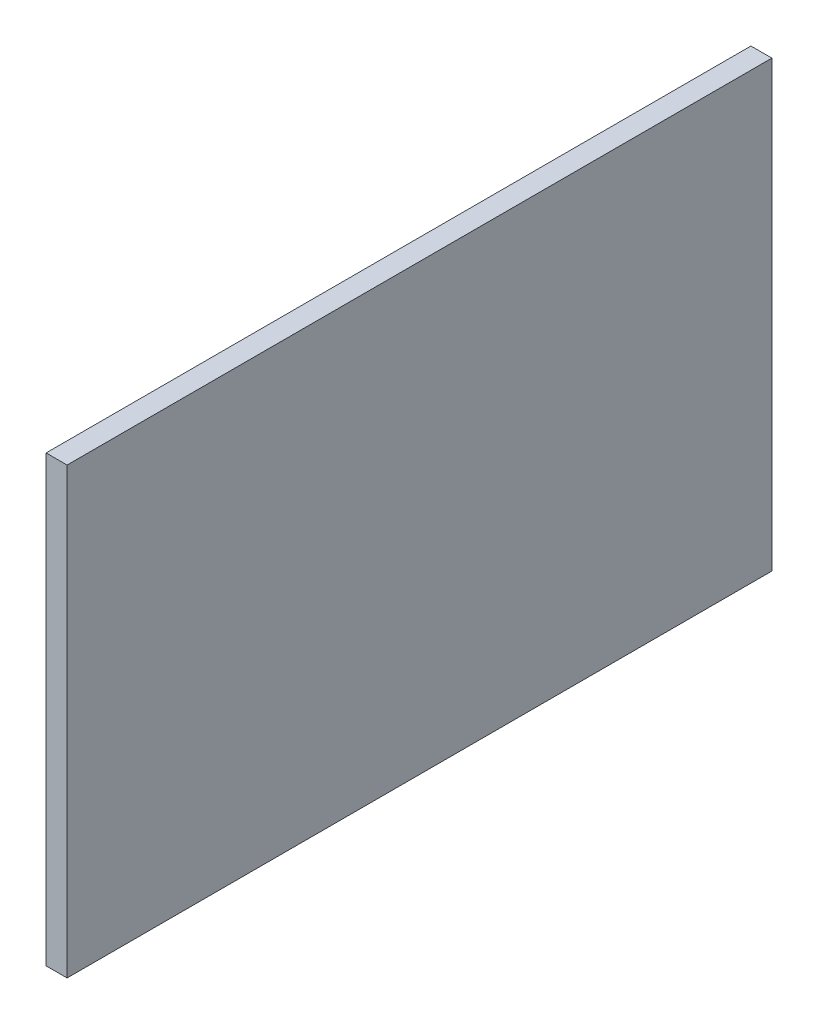
ISO-10303-21;
HEADER;
FILE_DESCRIPTION(('STEP AP214'),'2;1');
FILE_NAME('part.step','',(''),(''),'','','');
FILE_SCHEMA(('AUTOMOTIVE_DESIGN { 1 0 10303 214 1 1 1 1 }'));
ENDSEC;
DATA;
#1=APPLICATION_CONTEXT('core data for automotive mechanical design processes');
#2=APPLICATION_PROTOCOL_DEFINITION('international standard','automotive_design',2000,#1);
#3=PRODUCT_CONTEXT('',#1,'mechanical');
#4=PRODUCT('Part','Part','',(#3));
#5=PRODUCT_RELATED_PRODUCT_CATEGORY('part','',(#4));
#6=PRODUCT_DEFINITION_FORMATION('','',#4);
#7=PRODUCT_DEFINITION_CONTEXT('part definition',#1,'design');
#8=PRODUCT_DEFINITION('design','',#6,#7);
#9=PRODUCT_DEFINITION_SHAPE('','',#8);
#10=(LENGTH_UNIT() NAMED_UNIT(*) SI_UNIT(.MILLI.,.METRE.));
#11=(NAMED_UNIT(*) PLANE_ANGLE_UNIT() SI_UNIT($,.RADIAN.));
#12=(NAMED_UNIT(*) SI_UNIT($,.STERADIAN.) SOLID_ANGLE_UNIT());
#13=UNCERTAINTY_MEASURE_WITH_UNIT(LENGTH_MEASURE(1.E-05),#10,'distance_accuracy_value','');
#14=(GEOMETRIC_REPRESENTATION_CONTEXT(3) GLOBAL_UNCERTAINTY_ASSIGNED_CONTEXT((#13)) GLOBAL_UNIT_ASSIGNED_CONTEXT((#10,
#11,#12)) REPRESENTATION_CONTEXT('',''));
#15=CARTESIAN_POINT('',(0.,0.,0.));
#16=DIRECTION('',(0.,0.,1.));
#17=DIRECTION('',(1.,0.,0.));
#18=AXIS2_PLACEMENT_3D('',#15,#16,#17);
#19=CARTESIAN_POINT('',(10.5,-222.5,-353.));
#20=DIRECTION('',(-1.,0.,0.));
#21=DIRECTION('',(0.,0.,-1.));
#22=AXIS2_PLACEMENT_3D('',#19,#20,#21);
#23=PLANE('',#22);
#24=DIRECTION('',(0.,1.,0.));
#25=VECTOR('',#24,1.);
#26=CARTESIAN_POINT('',(10.5,-222.5,353.));
#27=LINE('',#26,#25);
#28=CARTESIAN_POINT('',(10.5,-222.5,353.));
#29=VERTEX_POINT('',#28);
#30=CARTESIAN_POINT('',(10.5,222.5,353.));
#31=VERTEX_POINT('',#30);
#32=EDGE_CURVE('E79',#29,#31,#27,.T.);
#33=ORIENTED_EDGE('',*,*,#32,.F.);
#34=DIRECTION('',(0.,0.,1.));
#35=VECTOR('',#34,1.);
#36=CARTESIAN_POINT('',(10.5,-222.5,-353.));
#37=LINE('',#36,#35);
#38=CARTESIAN_POINT('',(10.5,-222.5,-353.));
#39=VERTEX_POINT('',#38);
#40=EDGE_CURVE('E78',#39,#29,#37,.T.);
#41=ORIENTED_EDGE('',*,*,#40,.F.);
#42=DIRECTION('',(0.,1.,0.));
#43=VECTOR('',#42,1.);
#44=CARTESIAN_POINT('',(10.5,-222.5,-353.));
#45=LINE('',#44,#43);
#46=CARTESIAN_POINT('',(10.5,222.5,-353.));
#47=VERTEX_POINT('',#46);
#48=EDGE_CURVE('E73',#39,#47,#45,.T.);
#49=ORIENTED_EDGE('',*,*,#48,.T.);
#50=DIRECTION('',(0.,0.,1.));
#51=VECTOR('',#50,1.);
#52=CARTESIAN_POINT('',(10.5,222.5,-353.));
#53=LINE('',#52,#51);
#54=EDGE_CURVE('E11',#47,#31,#53,.T.);
#55=ORIENTED_EDGE('',*,*,#54,.T.);
#56=EDGE_LOOP('',(#33,#41,#49,#55));
#57=FACE_BOUND('',#56,.T.);
#58=ADVANCED_FACE('F16',(#57),#23,.F.);
#59=CARTESIAN_POINT('',(-10.5,222.5,-353.));
#60=DIRECTION('',(0.,-1.,0.));
#61=DIRECTION('',(0.,0.,1.));
#62=AXIS2_PLACEMENT_3D('',#59,#60,#61);
#63=PLANE('',#62);
#64=DIRECTION('',(-1.,0.,0.));
#65=VECTOR('',#64,1.);
#66=CARTESIAN_POINT('',(-10.5,222.5,353.));
#67=LINE('',#66,#65);
#68=CARTESIAN_POINT('',(-10.5,222.5,353.));
#69=VERTEX_POINT('',#68);
#70=EDGE_CURVE('E81',#31,#69,#67,.T.);
#71=ORIENTED_EDGE('',*,*,#70,.F.);
#72=ORIENTED_EDGE('',*,*,#54,.F.);
#73=DIRECTION('',(-1.,0.,0.));
#74=VECTOR('',#73,1.);
#75=CARTESIAN_POINT('',(-10.5,222.5,-353.));
#76=LINE('',#75,#74);
#77=CARTESIAN_POINT('',(-10.5,222.5,-353.));
#78=VERTEX_POINT('',#77);
#79=EDGE_CURVE('E57',#47,#78,#76,.T.);
#80=ORIENTED_EDGE('',*,*,#79,.T.);
#81=DIRECTION('',(0.,0.,1.));
#82=VECTOR('',#81,1.);
#83=CARTESIAN_POINT('',(-10.5,222.5,-353.));
#84=LINE('',#83,#82);
#85=EDGE_CURVE('E24',#78,#69,#84,.T.);
#86=ORIENTED_EDGE('',*,*,#85,.T.);
#87=EDGE_LOOP('',(#71,#72,#80,#86));
#88=FACE_BOUND('',#87,.T.);
#89=ADVANCED_FACE('F71',(#88),#63,.F.);
#90=CARTESIAN_POINT('',(-10.5,-222.5,-353.));
#91=DIRECTION('',(1.,0.,0.));
#92=DIRECTION('',(0.,0.,1.));
#93=AXIS2_PLACEMENT_3D('',#90,#91,#92);
#94=PLANE('',#93);
#95=DIRECTION('',(0.,-1.,0.));
#96=VECTOR('',#95,1.);
#97=CARTESIAN_POINT('',(-10.5,-222.5,353.));
#98=LINE('',#97,#96);
#99=CARTESIAN_POINT('',(-10.5,-222.5,353.));
#100=VERTEX_POINT('',#99);
#101=EDGE_CURVE('E67',#69,#100,#98,.T.);
#102=ORIENTED_EDGE('',*,*,#101,.F.);
#103=ORIENTED_EDGE('',*,*,#85,.F.);
#104=DIRECTION('',(0.,-1.,0.));
#105=VECTOR('',#104,1.);
#106=CARTESIAN_POINT('',(-10.5,-222.5,-353.));
#107=LINE('',#106,#105);
#108=CARTESIAN_POINT('',(-10.5,-222.5,-353.));
#109=VERTEX_POINT('',#108);
#110=EDGE_CURVE('E60',#78,#109,#107,.T.);
#111=ORIENTED_EDGE('',*,*,#110,.T.);
#112=DIRECTION('',(0.,0.,1.));
#113=VECTOR('',#112,1.);
#114=CARTESIAN_POINT('',(-10.5,-222.5,-353.));
#115=LINE('',#114,#113);
#116=EDGE_CURVE('E70',#109,#100,#115,.T.);
#117=ORIENTED_EDGE('',*,*,#116,.T.);
#118=EDGE_LOOP('',(#102,#103,#111,#117));
#119=FACE_BOUND('',#118,.T.);
#120=ADVANCED_FACE('F66',(#119),#94,.F.);
#121=CARTESIAN_POINT('',(-10.5,-222.5,-353.));
#122=DIRECTION('',(0.,1.,0.));
#123=DIRECTION('',(0.,0.,-1.));
#124=AXIS2_PLACEMENT_3D('',#121,#122,#123);
#125=PLANE('',#124);
#126=DIRECTION('',(1.,0.,0.));
#127=VECTOR('',#126,1.);
#128=CARTESIAN_POINT('',(-10.5,-222.5,353.));
#129=LINE('',#128,#127);
#130=EDGE_CURVE('E46',#100,#29,#129,.T.);
#131=ORIENTED_EDGE('',*,*,#130,.F.);
#132=ORIENTED_EDGE('',*,*,#116,.F.);
#133=DIRECTION('',(1.,0.,0.));
#134=VECTOR('',#133,1.);
#135=CARTESIAN_POINT('',(-10.5,-222.5,-353.));
#136=LINE('',#135,#134);
#137=EDGE_CURVE('E32',#109,#39,#136,.T.);
#138=ORIENTED_EDGE('',*,*,#137,.T.);
#139=ORIENTED_EDGE('',*,*,#40,.T.);
#140=EDGE_LOOP('',(#131,#132,#138,#139));
#141=FACE_BOUND('',#140,.T.);
#142=ADVANCED_FACE('F90',(#141),#125,.F.);
#143=CARTESIAN_POINT('',(10.5,222.5,-353.));
#144=DIRECTION('',(0.,0.,1.));
#145=DIRECTION('',(-1.,0.,0.));
#146=AXIS2_PLACEMENT_3D('',#143,#144,#145);
#147=PLANE('',#146);
#148=ORIENTED_EDGE('',*,*,#48,.F.);
#149=ORIENTED_EDGE('',*,*,#137,.F.);
#150=ORIENTED_EDGE('',*,*,#110,.F.);
#151=ORIENTED_EDGE('',*,*,#79,.F.);
#152=EDGE_LOOP('',(#148,#149,#150,#151));
#153=FACE_BOUND('',#152,.T.);
#154=ADVANCED_FACE('F62',(#153),#147,.F.);
#155=CARTESIAN_POINT('',(10.5,222.5,353.));
#156=DIRECTION('',(0.,0.,1.));
#157=DIRECTION('',(-1.,0.,0.));
#158=AXIS2_PLACEMENT_3D('',#155,#156,#157);
#159=PLANE('',#158);
#160=ORIENTED_EDGE('',*,*,#32,.T.);
#161=ORIENTED_EDGE('',*,*,#70,.T.);
#162=ORIENTED_EDGE('',*,*,#101,.T.);
#163=ORIENTED_EDGE('',*,*,#130,.T.);
#164=EDGE_LOOP('',(#160,#161,#162,#163));
#165=FACE_BOUND('',#164,.T.);
#166=ADVANCED_FACE('F86',(#165),#159,.T.);
#167=CLOSED_SHELL('',(#58,#89,#120,#142,#154,#166));
#168=MANIFOLD_SOLID_BREP('B1',#167);
#169=ADVANCED_BREP_SHAPE_REPRESENTATION('',(#18,#168),#14);
#170=SHAPE_DEFINITION_REPRESENTATION(#9,#169);
ENDSEC;
END-ISO-10303-21;
